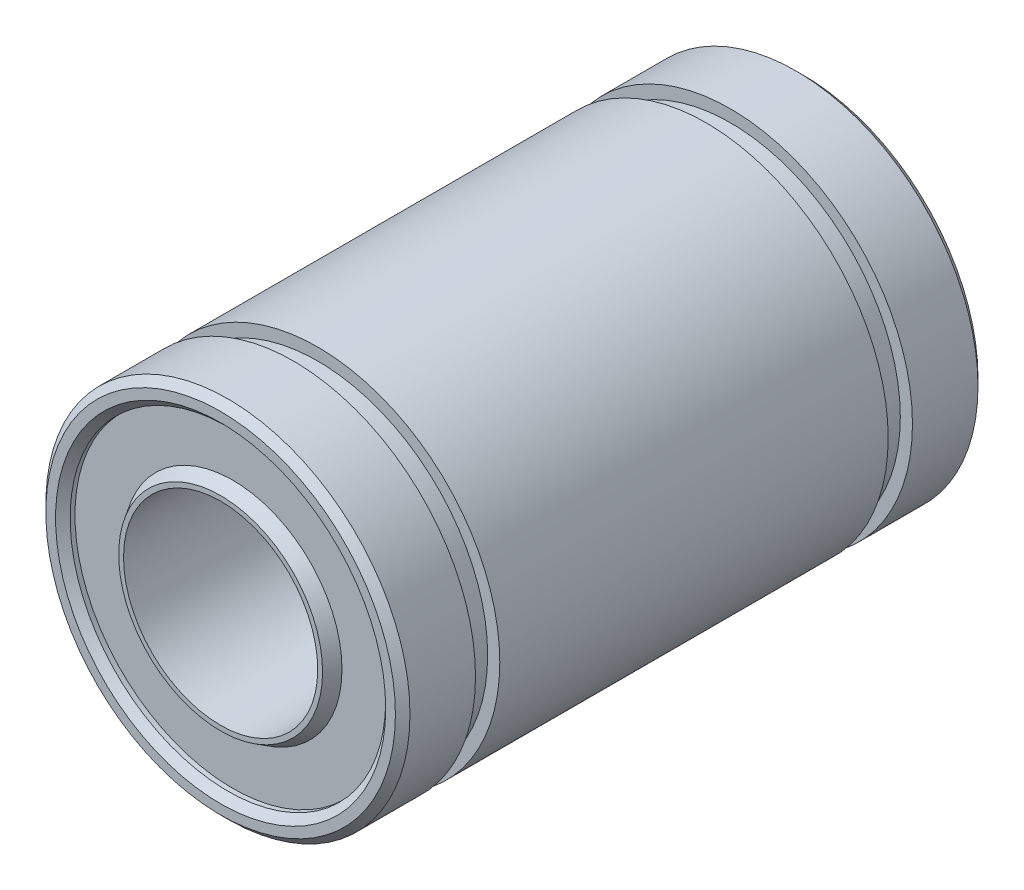
ISO-10303-21;
HEADER;
FILE_DESCRIPTION(('STEP AP214'),'2;1');
FILE_NAME('part.step','',(''),(''),'','','');
FILE_SCHEMA(('AUTOMOTIVE_DESIGN { 1 0 10303 214 1 1 1 1 }'));
ENDSEC;
DATA;
#1=APPLICATION_CONTEXT('core data for automotive mechanical design processes');
#2=APPLICATION_PROTOCOL_DEFINITION('international standard','automotive_design',2000,#1);
#3=PRODUCT_CONTEXT('',#1,'mechanical');
#4=PRODUCT('Part','Part','',(#3));
#5=PRODUCT_RELATED_PRODUCT_CATEGORY('part','',(#4));
#6=PRODUCT_DEFINITION_FORMATION('','',#4);
#7=PRODUCT_DEFINITION_CONTEXT('part definition',#1,'design');
#8=PRODUCT_DEFINITION('design','',#6,#7);
#9=PRODUCT_DEFINITION_SHAPE('','',#8);
#10=(LENGTH_UNIT() NAMED_UNIT(*) SI_UNIT(.MILLI.,.METRE.));
#11=(NAMED_UNIT(*) PLANE_ANGLE_UNIT() SI_UNIT($,.RADIAN.));
#12=(NAMED_UNIT(*) SI_UNIT($,.STERADIAN.) SOLID_ANGLE_UNIT());
#13=UNCERTAINTY_MEASURE_WITH_UNIT(LENGTH_MEASURE(1.E-05),#10,'distance_accuracy_value','');
#14=(GEOMETRIC_REPRESENTATION_CONTEXT(3) GLOBAL_UNCERTAINTY_ASSIGNED_CONTEXT((#13)) GLOBAL_UNIT_ASSIGNED_CONTEXT((#10,
#11,#12)) REPRESENTATION_CONTEXT('',''));
#15=CARTESIAN_POINT('',(0.,0.,0.));
#16=DIRECTION('',(0.,0.,1.));
#17=DIRECTION('',(1.,0.,0.));
#18=AXIS2_PLACEMENT_3D('',#15,#16,#17);
#19=CARTESIAN_POINT('',(0.,0.,0.));
#20=DIRECTION('',(0.,0.,-1.));
#21=DIRECTION('',(-1.,0.,0.));
#22=AXIS2_PLACEMENT_3D('',#19,#20,#21);
#23=CYLINDRICAL_SURFACE('',#22,4.);
#24=CARTESIAN_POINT('',(0.,0.,12.));
#25=DIRECTION('',(0.,0.,-1.));
#26=DIRECTION('',(-1.,0.,0.));
#27=AXIS2_PLACEMENT_3D('',#24,#25,#26);
#28=CIRCLE('',#27,4.);
#29=CARTESIAN_POINT('',(4.,0.,12.));
#30=VERTEX_POINT('',#29);
#31=EDGE_CURVE('E124',#30,#30,#28,.T.);
#32=ORIENTED_EDGE('',*,*,#31,.F.);
#33=EDGE_LOOP('',(#32));
#34=FACE_BOUND('',#33,.T.);
#35=CARTESIAN_POINT('',(0.,0.,-12.));
#36=DIRECTION('',(0.,0.,1.));
#37=DIRECTION('',(-1.,0.,0.));
#38=AXIS2_PLACEMENT_3D('',#35,#36,#37);
#39=CIRCLE('',#38,4.);
#40=CARTESIAN_POINT('',(4.,0.,-12.));
#41=VERTEX_POINT('',#40);
#42=EDGE_CURVE('E98',#41,#41,#39,.T.);
#43=ORIENTED_EDGE('',*,*,#42,.F.);
#44=EDGE_LOOP('',(#43));
#45=FACE_BOUND('',#44,.T.);
#46=ADVANCED_FACE('F16',(#34,#45),#23,.F.);
#47=CARTESIAN_POINT('',(0.,0.,11.5));
#48=DIRECTION('',(0.,0.,1.));
#49=DIRECTION('',(1.,0.,0.));
#50=AXIS2_PLACEMENT_3D('',#47,#48,#49);
#51=PLANE('',#50);
#52=CARTESIAN_POINT('',(0.,0.,11.5));
#53=DIRECTION('',(0.,0.,1.));
#54=DIRECTION('',(-1.,0.,0.));
#55=AXIS2_PLACEMENT_3D('',#52,#53,#54);
#56=CIRCLE('',#55,6.5);
#57=CARTESIAN_POINT('',(6.5,0.,11.5));
#58=VERTEX_POINT('',#57);
#59=EDGE_CURVE('E11',#58,#58,#56,.T.);
#60=ORIENTED_EDGE('',*,*,#59,.T.);
#61=EDGE_LOOP('',(#60));
#62=FACE_BOUND('',#61,.T.);
#63=CARTESIAN_POINT('',(0.,0.,11.5));
#64=DIRECTION('',(0.,0.,1.));
#65=DIRECTION('',(-1.,0.,0.));
#66=AXIS2_PLACEMENT_3D('',#63,#64,#65);
#67=CIRCLE('',#66,4.5);
#68=CARTESIAN_POINT('',(4.5,0.,11.5));
#69=VERTEX_POINT('',#68);
#70=EDGE_CURVE('E120',#69,#69,#67,.T.);
#71=ORIENTED_EDGE('',*,*,#70,.F.);
#72=EDGE_LOOP('',(#71));
#73=FACE_BOUND('',#72,.T.);
#74=ADVANCED_FACE('F160',(#62,#73),#51,.T.);
#75=CARTESIAN_POINT('',(0.,0.,-11.5));
#76=DIRECTION('',(0.,0.,1.));
#77=DIRECTION('',(1.,0.,0.));
#78=AXIS2_PLACEMENT_3D('',#75,#76,#77);
#79=PLANE('',#78);
#80=CARTESIAN_POINT('',(0.,0.,-11.5));
#81=DIRECTION('',(0.,0.,-1.));
#82=DIRECTION('',(-1.,0.,0.));
#83=AXIS2_PLACEMENT_3D('',#80,#81,#82);
#84=CIRCLE('',#83,6.5);
#85=CARTESIAN_POINT('',(6.5,0.,-11.5));
#86=VERTEX_POINT('',#85);
#87=EDGE_CURVE('E110',#86,#86,#84,.T.);
#88=ORIENTED_EDGE('',*,*,#87,.T.);
#89=EDGE_LOOP('',(#88));
#90=FACE_BOUND('',#89,.T.);
#91=CARTESIAN_POINT('',(0.,0.,-11.5));
#92=DIRECTION('',(0.,0.,-1.));
#93=DIRECTION('',(-1.,0.,0.));
#94=AXIS2_PLACEMENT_3D('',#91,#92,#93);
#95=CIRCLE('',#94,4.5);
#96=CARTESIAN_POINT('',(4.5,0.,-11.5));
#97=VERTEX_POINT('',#96);
#98=EDGE_CURVE('E122',#97,#97,#95,.T.);
#99=ORIENTED_EDGE('',*,*,#98,.F.);
#100=EDGE_LOOP('',(#99));
#101=FACE_BOUND('',#100,.T.);
#102=ADVANCED_FACE('F166',(#90,#101),#79,.F.);
#103=CARTESIAN_POINT('',(0.,0.,0.));
#104=DIRECTION('',(0.,0.,-1.));
#105=DIRECTION('',(-1.,0.,0.));
#106=AXIS2_PLACEMENT_3D('',#103,#104,#105);
#107=CYLINDRICAL_SURFACE('',#106,6.5);
#108=CARTESIAN_POINT('',(0.,0.,11.7));
#109=DIRECTION('',(0.,0.,-1.));
#110=DIRECTION('',(-1.,0.,0.));
#111=AXIS2_PLACEMENT_3D('',#108,#109,#110);
#112=CIRCLE('',#111,6.5);
#113=CARTESIAN_POINT('',(6.5,0.,11.7));
#114=VERTEX_POINT('',#113);
#115=EDGE_CURVE('E26',#114,#114,#112,.T.);
#116=ORIENTED_EDGE('',*,*,#115,.F.);
#117=EDGE_LOOP('',(#116));
#118=FACE_BOUND('',#117,.T.);
#119=ORIENTED_EDGE('',*,*,#59,.F.);
#120=EDGE_LOOP('',(#119));
#121=FACE_BOUND('',#120,.T.);
#122=ADVANCED_FACE('F190',(#118,#121),#107,.F.);
#123=CARTESIAN_POINT('',(0.,0.,11.85));
#124=DIRECTION('',(0.,0.,1.));
#125=DIRECTION('',(-1.,0.,0.));
#126=AXIS2_PLACEMENT_3D('',#123,#124,#125);
#127=CONICAL_SURFACE('',#126,6.65,0.785398163397448);
#128=CARTESIAN_POINT('',(0.,0.,12.));
#129=DIRECTION('',(0.,0.,1.));
#130=DIRECTION('',(-1.,0.,0.));
#131=AXIS2_PLACEMENT_3D('',#128,#129,#130);
#132=CIRCLE('',#131,6.8);
#133=CARTESIAN_POINT('',(6.8,0.,12.));
#134=VERTEX_POINT('',#133);
#135=EDGE_CURVE('E127',#134,#134,#132,.T.);
#136=ORIENTED_EDGE('',*,*,#135,.T.);
#137=EDGE_LOOP('',(#136));
#138=FACE_BOUND('',#137,.T.);
#139=ORIENTED_EDGE('',*,*,#115,.T.);
#140=EDGE_LOOP('',(#139));
#141=FACE_BOUND('',#140,.T.);
#142=ADVANCED_FACE('F188',(#138,#141),#127,.F.);
#143=CARTESIAN_POINT('',(0.,0.,12.));
#144=DIRECTION('',(0.,0.,1.));
#145=DIRECTION('',(1.,0.,0.));
#146=AXIS2_PLACEMENT_3D('',#143,#144,#145);
#147=PLANE('',#146);
#148=CARTESIAN_POINT('',(0.,0.,12.));
#149=DIRECTION('',(0.,0.,-1.));
#150=DIRECTION('',(-1.,0.,0.));
#151=AXIS2_PLACEMENT_3D('',#148,#149,#150);
#152=CIRCLE('',#151,7.2);
#153=CARTESIAN_POINT('',(7.2,0.,12.));
#154=VERTEX_POINT('',#153);
#155=EDGE_CURVE('E109',#154,#154,#152,.T.);
#156=ORIENTED_EDGE('',*,*,#155,.F.);
#157=EDGE_LOOP('',(#156));
#158=FACE_BOUND('',#157,.T.);
#159=ORIENTED_EDGE('',*,*,#135,.F.);
#160=EDGE_LOOP('',(#159));
#161=FACE_BOUND('',#160,.T.);
#162=ADVANCED_FACE('F172',(#158,#161),#147,.T.);
#163=CARTESIAN_POINT('',(0.,0.,11.85));
#164=DIRECTION('',(0.,0.,-1.));
#165=DIRECTION('',(-1.,0.,0.));
#166=AXIS2_PLACEMENT_3D('',#163,#164,#165);
#167=CONICAL_SURFACE('',#166,7.35,0.785398163397448);
#168=ORIENTED_EDGE('',*,*,#155,.T.);
#169=EDGE_LOOP('',(#168));
#170=FACE_BOUND('',#169,.T.);
#171=CARTESIAN_POINT('',(0.,0.,11.7));
#172=DIRECTION('',(0.,0.,1.));
#173=DIRECTION('',(-1.,0.,0.));
#174=AXIS2_PLACEMENT_3D('',#171,#172,#173);
#175=CIRCLE('',#174,7.5);
#176=CARTESIAN_POINT('',(7.5,0.,11.7));
#177=VERTEX_POINT('',#176);
#178=EDGE_CURVE('E118',#177,#177,#175,.T.);
#179=ORIENTED_EDGE('',*,*,#178,.T.);
#180=EDGE_LOOP('',(#179));
#181=FACE_BOUND('',#180,.T.);
#182=ADVANCED_FACE('F183',(#170,#181),#167,.T.);
#183=CARTESIAN_POINT('',(0.,0.,0.));
#184=DIRECTION('',(0.,0.,-1.));
#185=DIRECTION('',(-1.,0.,0.));
#186=AXIS2_PLACEMENT_3D('',#183,#184,#185);
#187=CYLINDRICAL_SURFACE('',#186,7.5);
#188=CARTESIAN_POINT('',(0.,0.,-11.7));
#189=DIRECTION('',(0.,0.,-1.));
#190=DIRECTION('',(-1.,0.,0.));
#191=AXIS2_PLACEMENT_3D('',#188,#189,#190);
#192=CIRCLE('',#191,7.5);
#193=CARTESIAN_POINT('',(7.5,0.,-11.7));
#194=VERTEX_POINT('',#193);
#195=EDGE_CURVE('E107',#194,#194,#192,.T.);
#196=ORIENTED_EDGE('',*,*,#195,.F.);
#197=EDGE_LOOP('',(#196));
#198=FACE_BOUND('',#197,.T.);
#199=CARTESIAN_POINT('',(0.,0.,-9.));
#200=DIRECTION('',(0.,0.,-1.));
#201=DIRECTION('',(-1.,0.,0.));
#202=AXIS2_PLACEMENT_3D('',#199,#200,#201);
#203=CIRCLE('',#202,7.5);
#204=CARTESIAN_POINT('',(7.5,0.,-9.));
#205=VERTEX_POINT('',#204);
#206=EDGE_CURVE('E131',#205,#205,#203,.T.);
#207=ORIENTED_EDGE('',*,*,#206,.T.);
#208=EDGE_LOOP('',(#207));
#209=FACE_BOUND('',#208,.T.);
#210=ADVANCED_FACE('F179',(#198,#209),#187,.T.);
#211=CARTESIAN_POINT('',(0.,0.,-11.85));
#212=DIRECTION('',(0.,0.,1.));
#213=DIRECTION('',(-1.,0.,0.));
#214=AXIS2_PLACEMENT_3D('',#211,#212,#213);
#215=CONICAL_SURFACE('',#214,7.35,0.785398163397448);
#216=CARTESIAN_POINT('',(0.,0.,-12.));
#217=DIRECTION('',(0.,0.,1.));
#218=DIRECTION('',(-1.,0.,0.));
#219=AXIS2_PLACEMENT_3D('',#216,#217,#218);
#220=CIRCLE('',#219,7.2);
#221=CARTESIAN_POINT('',(7.2,0.,-12.));
#222=VERTEX_POINT('',#221);
#223=EDGE_CURVE('E20',#222,#222,#220,.T.);
#224=ORIENTED_EDGE('',*,*,#223,.T.);
#225=EDGE_LOOP('',(#224));
#226=FACE_BOUND('',#225,.T.);
#227=ORIENTED_EDGE('',*,*,#195,.T.);
#228=EDGE_LOOP('',(#227));
#229=FACE_BOUND('',#228,.T.);
#230=ADVANCED_FACE('F182',(#226,#229),#215,.T.);
#231=CARTESIAN_POINT('',(0.,0.,0.));
#232=DIRECTION('',(0.,0.,-1.));
#233=DIRECTION('',(-1.,0.,0.));
#234=AXIS2_PLACEMENT_3D('',#231,#232,#233);
#235=CYLINDRICAL_SURFACE('',#234,6.5);
#236=CARTESIAN_POINT('',(0.,0.,-11.7));
#237=DIRECTION('',(0.,0.,1.));
#238=DIRECTION('',(-1.,0.,0.));
#239=AXIS2_PLACEMENT_3D('',#236,#237,#238);
#240=CIRCLE('',#239,6.5);
#241=CARTESIAN_POINT('',(6.5,0.,-11.7));
#242=VERTEX_POINT('',#241);
#243=EDGE_CURVE('E94',#242,#242,#240,.T.);
#244=ORIENTED_EDGE('',*,*,#243,.F.);
#245=EDGE_LOOP('',(#244));
#246=FACE_BOUND('',#245,.T.);
#247=ORIENTED_EDGE('',*,*,#87,.F.);
#248=EDGE_LOOP('',(#247));
#249=FACE_BOUND('',#248,.T.);
#250=ADVANCED_FACE('F215',(#246,#249),#235,.F.);
#251=CARTESIAN_POINT('',(0.,0.,-12.));
#252=DIRECTION('',(0.,0.,1.));
#253=DIRECTION('',(1.,0.,0.));
#254=AXIS2_PLACEMENT_3D('',#251,#252,#253);
#255=PLANE('',#254);
#256=CARTESIAN_POINT('',(0.,0.,-12.));
#257=DIRECTION('',(0.,0.,-1.));
#258=DIRECTION('',(-1.,0.,0.));
#259=AXIS2_PLACEMENT_3D('',#256,#257,#258);
#260=CIRCLE('',#259,6.8);
#261=CARTESIAN_POINT('',(6.8,0.,-12.));
#262=VERTEX_POINT('',#261);
#263=EDGE_CURVE('E97',#262,#262,#260,.T.);
#264=ORIENTED_EDGE('',*,*,#263,.F.);
#265=EDGE_LOOP('',(#264));
#266=FACE_BOUND('',#265,.T.);
#267=ORIENTED_EDGE('',*,*,#223,.F.);
#268=EDGE_LOOP('',(#267));
#269=FACE_BOUND('',#268,.T.);
#270=ADVANCED_FACE('F211',(#266,#269),#255,.F.);
#271=CARTESIAN_POINT('',(0.,0.,-11.85));
#272=DIRECTION('',(0.,0.,-1.));
#273=DIRECTION('',(-1.,0.,0.));
#274=AXIS2_PLACEMENT_3D('',#271,#272,#273);
#275=CONICAL_SURFACE('',#274,6.65,0.785398163397448);
#276=ORIENTED_EDGE('',*,*,#263,.T.);
#277=EDGE_LOOP('',(#276));
#278=FACE_BOUND('',#277,.T.);
#279=ORIENTED_EDGE('',*,*,#243,.T.);
#280=EDGE_LOOP('',(#279));
#281=FACE_BOUND('',#280,.T.);
#282=ADVANCED_FACE('F95',(#278,#281),#275,.F.);
#283=CARTESIAN_POINT('',(0.,0.,-12.));
#284=DIRECTION('',(0.,0.,1.));
#285=DIRECTION('',(1.,0.,0.));
#286=AXIS2_PLACEMENT_3D('',#283,#284,#285);
#287=PLANE('',#286);
#288=CARTESIAN_POINT('',(0.,0.,-12.));
#289=DIRECTION('',(0.,0.,1.));
#290=DIRECTION('',(-1.,0.,0.));
#291=AXIS2_PLACEMENT_3D('',#288,#289,#290);
#292=CIRCLE('',#291,4.2);
#293=CARTESIAN_POINT('',(4.2,0.,-12.));
#294=VERTEX_POINT('',#293);
#295=EDGE_CURVE('E101',#294,#294,#292,.T.);
#296=ORIENTED_EDGE('',*,*,#295,.F.);
#297=EDGE_LOOP('',(#296));
#298=FACE_BOUND('',#297,.T.);
#299=ORIENTED_EDGE('',*,*,#42,.T.);
#300=EDGE_LOOP('',(#299));
#301=FACE_BOUND('',#300,.T.);
#302=ADVANCED_FACE('F174',(#298,#301),#287,.F.);
#303=CARTESIAN_POINT('',(0.,0.,-11.75));
#304=DIRECTION('',(0.,0.,1.));
#305=DIRECTION('',(-1.,0.,0.));
#306=AXIS2_PLACEMENT_3D('',#303,#304,#305);
#307=CONICAL_SURFACE('',#306,4.35,0.540419500270583);
#308=ORIENTED_EDGE('',*,*,#295,.T.);
#309=EDGE_LOOP('',(#308));
#310=FACE_BOUND('',#309,.T.);
#311=ORIENTED_EDGE('',*,*,#98,.T.);
#312=EDGE_LOOP('',(#311));
#313=FACE_BOUND('',#312,.T.);
#314=ADVANCED_FACE('F177',(#310,#313),#307,.T.);
#315=CARTESIAN_POINT('',(0.,0.,12.));
#316=DIRECTION('',(0.,0.,1.));
#317=DIRECTION('',(1.,0.,0.));
#318=AXIS2_PLACEMENT_3D('',#315,#316,#317);
#319=PLANE('',#318);
#320=CARTESIAN_POINT('',(0.,0.,12.));
#321=DIRECTION('',(0.,0.,-1.));
#322=DIRECTION('',(-1.,0.,0.));
#323=AXIS2_PLACEMENT_3D('',#320,#321,#322);
#324=CIRCLE('',#323,4.2);
#325=CARTESIAN_POINT('',(4.2,0.,12.));
#326=VERTEX_POINT('',#325);
#327=EDGE_CURVE('E128',#326,#326,#324,.T.);
#328=ORIENTED_EDGE('',*,*,#327,.F.);
#329=EDGE_LOOP('',(#328));
#330=FACE_BOUND('',#329,.T.);
#331=ORIENTED_EDGE('',*,*,#31,.T.);
#332=EDGE_LOOP('',(#331));
#333=FACE_BOUND('',#332,.T.);
#334=ADVANCED_FACE('F204',(#330,#333),#319,.T.);
#335=CARTESIAN_POINT('',(0.,0.,11.75));
#336=DIRECTION('',(0.,0.,-1.));
#337=DIRECTION('',(-1.,0.,0.));
#338=AXIS2_PLACEMENT_3D('',#335,#336,#337);
#339=CONICAL_SURFACE('',#338,4.35,0.540419500270583);
#340=ORIENTED_EDGE('',*,*,#327,.T.);
#341=EDGE_LOOP('',(#340));
#342=FACE_BOUND('',#341,.T.);
#343=ORIENTED_EDGE('',*,*,#70,.T.);
#344=EDGE_LOOP('',(#343));
#345=FACE_BOUND('',#344,.T.);
#346=ADVANCED_FACE('F207',(#342,#345),#339,.T.);
#347=CARTESIAN_POINT('',(0.,0.,0.));
#348=DIRECTION('',(0.,0.,-1.));
#349=DIRECTION('',(-1.,0.,0.));
#350=AXIS2_PLACEMENT_3D('',#347,#348,#349);
#351=CYLINDRICAL_SURFACE('',#350,7.5);
#352=CARTESIAN_POINT('',(0.,0.,9.));
#353=DIRECTION('',(0.,0.,1.));
#354=DIRECTION('',(-1.,0.,0.));
#355=AXIS2_PLACEMENT_3D('',#352,#353,#354);
#356=CIRCLE('',#355,7.5);
#357=CARTESIAN_POINT('',(7.5,0.,9.));
#358=VERTEX_POINT('',#357);
#359=EDGE_CURVE('E121',#358,#358,#356,.T.);
#360=ORIENTED_EDGE('',*,*,#359,.T.);
#361=EDGE_LOOP('',(#360));
#362=FACE_BOUND('',#361,.T.);
#363=ORIENTED_EDGE('',*,*,#178,.F.);
#364=EDGE_LOOP('',(#363));
#365=FACE_BOUND('',#364,.T.);
#366=ADVANCED_FACE('F154',(#362,#365),#351,.T.);
#367=CARTESIAN_POINT('',(0.,0.,9.));
#368=DIRECTION('',(0.,0.,1.));
#369=DIRECTION('',(1.,0.,0.));
#370=AXIS2_PLACEMENT_3D('',#367,#368,#369);
#371=PLANE('',#370);
#372=ORIENTED_EDGE('',*,*,#359,.F.);
#373=EDGE_LOOP('',(#372));
#374=FACE_BOUND('',#373,.T.);
#375=CARTESIAN_POINT('',(0.,0.,9.));
#376=DIRECTION('',(0.,0.,-1.));
#377=DIRECTION('',(-1.,0.,0.));
#378=AXIS2_PLACEMENT_3D('',#375,#376,#377);
#379=CIRCLE('',#378,7.);
#380=CARTESIAN_POINT('',(7.,0.,9.));
#381=VERTEX_POINT('',#380);
#382=EDGE_CURVE('E114',#381,#381,#379,.T.);
#383=ORIENTED_EDGE('',*,*,#382,.F.);
#384=EDGE_LOOP('',(#383));
#385=FACE_BOUND('',#384,.T.);
#386=ADVANCED_FACE('F144',(#374,#385),#371,.F.);
#387=CARTESIAN_POINT('',(0.,0.,-9.));
#388=DIRECTION('',(0.,0.,1.));
#389=DIRECTION('',(1.,0.,0.));
#390=AXIS2_PLACEMENT_3D('',#387,#388,#389);
#391=PLANE('',#390);
#392=ORIENTED_EDGE('',*,*,#206,.F.);
#393=EDGE_LOOP('',(#392));
#394=FACE_BOUND('',#393,.T.);
#395=CARTESIAN_POINT('',(0.,0.,-9.));
#396=DIRECTION('',(0.,0.,1.));
#397=DIRECTION('',(-1.,0.,0.));
#398=AXIS2_PLACEMENT_3D('',#395,#396,#397);
#399=CIRCLE('',#398,7.);
#400=CARTESIAN_POINT('',(7.,0.,-9.));
#401=VERTEX_POINT('',#400);
#402=EDGE_CURVE('E134',#401,#401,#399,.T.);
#403=ORIENTED_EDGE('',*,*,#402,.F.);
#404=EDGE_LOOP('',(#403));
#405=FACE_BOUND('',#404,.T.);
#406=ADVANCED_FACE('F142',(#394,#405),#391,.T.);
#407=CARTESIAN_POINT('',(0.,0.,0.));
#408=DIRECTION('',(0.,0.,-1.));
#409=DIRECTION('',(-1.,0.,0.));
#410=AXIS2_PLACEMENT_3D('',#407,#408,#409);
#411=CYLINDRICAL_SURFACE('',#410,7.);
#412=ORIENTED_EDGE('',*,*,#402,.T.);
#413=EDGE_LOOP('',(#412));
#414=FACE_BOUND('',#413,.T.);
#415=CARTESIAN_POINT('',(0.,0.,-8.));
#416=DIRECTION('',(0.,0.,-1.));
#417=DIRECTION('',(-1.,0.,0.));
#418=AXIS2_PLACEMENT_3D('',#415,#416,#417);
#419=CIRCLE('',#418,7.);
#420=CARTESIAN_POINT('',(7.,0.,-8.));
#421=VERTEX_POINT('',#420);
#422=EDGE_CURVE('E230',#421,#421,#419,.T.);
#423=ORIENTED_EDGE('',*,*,#422,.T.);
#424=EDGE_LOOP('',(#423));
#425=FACE_BOUND('',#424,.T.);
#426=ADVANCED_FACE('F139',(#414,#425),#411,.T.);
#427=CARTESIAN_POINT('',(0.,0.,0.));
#428=DIRECTION('',(0.,0.,-1.));
#429=DIRECTION('',(-1.,0.,0.));
#430=AXIS2_PLACEMENT_3D('',#427,#428,#429);
#431=CYLINDRICAL_SURFACE('',#430,7.);
#432=CARTESIAN_POINT('',(0.,0.,8.));
#433=DIRECTION('',(0.,0.,1.));
#434=DIRECTION('',(-1.,0.,0.));
#435=AXIS2_PLACEMENT_3D('',#432,#433,#434);
#436=CIRCLE('',#435,7.);
#437=CARTESIAN_POINT('',(7.,0.,8.));
#438=VERTEX_POINT('',#437);
#439=EDGE_CURVE('E111',#438,#438,#436,.T.);
#440=ORIENTED_EDGE('',*,*,#439,.T.);
#441=EDGE_LOOP('',(#440));
#442=FACE_BOUND('',#441,.T.);
#443=ORIENTED_EDGE('',*,*,#382,.T.);
#444=EDGE_LOOP('',(#443));
#445=FACE_BOUND('',#444,.T.);
#446=ADVANCED_FACE('F152',(#442,#445),#431,.T.);
#447=CARTESIAN_POINT('',(0.,0.,8.));
#448=DIRECTION('',(0.,0.,1.));
#449=DIRECTION('',(1.,0.,0.));
#450=AXIS2_PLACEMENT_3D('',#447,#448,#449);
#451=PLANE('',#450);
#452=CARTESIAN_POINT('',(0.,0.,8.));
#453=DIRECTION('',(0.,0.,1.));
#454=DIRECTION('',(-1.,0.,0.));
#455=AXIS2_PLACEMENT_3D('',#452,#453,#454);
#456=CIRCLE('',#455,7.5);
#457=CARTESIAN_POINT('',(7.5,0.,8.));
#458=VERTEX_POINT('',#457);
#459=EDGE_CURVE('E115',#458,#458,#456,.T.);
#460=ORIENTED_EDGE('',*,*,#459,.T.);
#461=EDGE_LOOP('',(#460));
#462=FACE_BOUND('',#461,.T.);
#463=ORIENTED_EDGE('',*,*,#439,.F.);
#464=EDGE_LOOP('',(#463));
#465=FACE_BOUND('',#464,.T.);
#466=ADVANCED_FACE('F18',(#462,#465),#451,.T.);
#467=CARTESIAN_POINT('',(0.,0.,0.));
#468=DIRECTION('',(0.,0.,-1.));
#469=DIRECTION('',(-1.,0.,0.));
#470=AXIS2_PLACEMENT_3D('',#467,#468,#469);
#471=CYLINDRICAL_SURFACE('',#470,7.5);
#472=ORIENTED_EDGE('',*,*,#459,.F.);
#473=EDGE_LOOP('',(#472));
#474=FACE_BOUND('',#473,.T.);
#475=CARTESIAN_POINT('',(0.,0.,-8.));
#476=DIRECTION('',(0.,0.,-1.));
#477=DIRECTION('',(-1.,0.,0.));
#478=AXIS2_PLACEMENT_3D('',#475,#476,#477);
#479=CIRCLE('',#478,7.5);
#480=CARTESIAN_POINT('',(7.5,0.,-8.));
#481=VERTEX_POINT('',#480);
#482=EDGE_CURVE('E105',#481,#481,#479,.T.);
#483=ORIENTED_EDGE('',*,*,#482,.F.);
#484=EDGE_LOOP('',(#483));
#485=FACE_BOUND('',#484,.T.);
#486=ADVANCED_FACE('F196',(#474,#485),#471,.T.);
#487=CARTESIAN_POINT('',(0.,0.,-8.));
#488=DIRECTION('',(0.,0.,1.));
#489=DIRECTION('',(1.,0.,0.));
#490=AXIS2_PLACEMENT_3D('',#487,#488,#489);
#491=PLANE('',#490);
#492=ORIENTED_EDGE('',*,*,#482,.T.);
#493=EDGE_LOOP('',(#492));
#494=FACE_BOUND('',#493,.T.);
#495=ORIENTED_EDGE('',*,*,#422,.F.);
#496=EDGE_LOOP('',(#495));
#497=FACE_BOUND('',#496,.T.);
#498=ADVANCED_FACE('F193',(#494,#497),#491,.F.);
#499=CLOSED_SHELL('',(#46,#74,#102,#122,#142,#162,#182,#210,#230,#250,#270,#282,#302,#314,#334,
#346,#366,#386,#406,#426,#446,#466,#486,#498));
#500=MANIFOLD_SOLID_BREP('B1',#499);
#501=ADVANCED_BREP_SHAPE_REPRESENTATION('',(#18,#500),#14);
#502=SHAPE_DEFINITION_REPRESENTATION(#9,#501);
ENDSEC;
END-ISO-10303-21;
